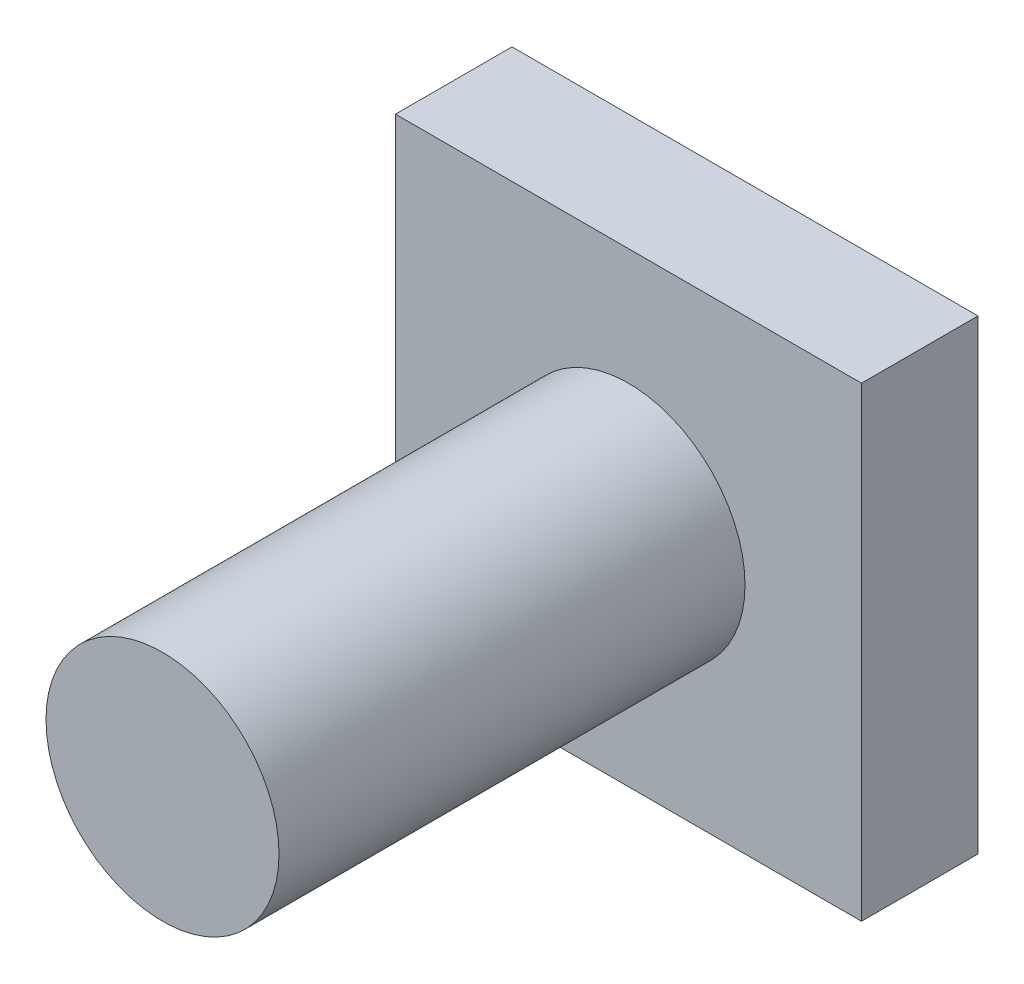
ISO-10303-21;
HEADER;
FILE_DESCRIPTION(('STEP AP214'),'2;1');
FILE_NAME('part.step','',(''),(''),'','','');
FILE_SCHEMA(('AUTOMOTIVE_DESIGN { 1 0 10303 214 1 1 1 1 }'));
ENDSEC;
DATA;
#1=APPLICATION_CONTEXT('core data for automotive mechanical design processes');
#2=APPLICATION_PROTOCOL_DEFINITION('international standard','automotive_design',2000,#1);
#3=PRODUCT_CONTEXT('',#1,'mechanical');
#4=PRODUCT('Part','Part','',(#3));
#5=PRODUCT_RELATED_PRODUCT_CATEGORY('part','',(#4));
#6=PRODUCT_DEFINITION_FORMATION('','',#4);
#7=PRODUCT_DEFINITION_CONTEXT('part definition',#1,'design');
#8=PRODUCT_DEFINITION('design','',#6,#7);
#9=PRODUCT_DEFINITION_SHAPE('','',#8);
#10=(LENGTH_UNIT() NAMED_UNIT(*) SI_UNIT(.MILLI.,.METRE.));
#11=(NAMED_UNIT(*) PLANE_ANGLE_UNIT() SI_UNIT($,.RADIAN.));
#12=(NAMED_UNIT(*) SI_UNIT($,.STERADIAN.) SOLID_ANGLE_UNIT());
#13=UNCERTAINTY_MEASURE_WITH_UNIT(LENGTH_MEASURE(1.E-05),#10,'distance_accuracy_value','');
#14=(GEOMETRIC_REPRESENTATION_CONTEXT(3) GLOBAL_UNCERTAINTY_ASSIGNED_CONTEXT((#13)) GLOBAL_UNIT_ASSIGNED_CONTEXT((#10,
#11,#12)) REPRESENTATION_CONTEXT('',''));
#15=CARTESIAN_POINT('',(0.,0.,0.));
#16=DIRECTION('',(0.,0.,1.));
#17=DIRECTION('',(1.,0.,0.));
#18=AXIS2_PLACEMENT_3D('',#15,#16,#17);
#19=CARTESIAN_POINT('',(0.,0.,10.));
#20=DIRECTION('',(0.,0.,-1.));
#21=DIRECTION('',(-1.,0.,0.));
#22=AXIS2_PLACEMENT_3D('',#19,#20,#21);
#23=CYLINDRICAL_SURFACE('',#22,5.);
#24=CARTESIAN_POINT('',(0.,0.,10.));
#25=DIRECTION('',(0.,0.,1.));
#26=DIRECTION('',(1.,0.,0.));
#27=AXIS2_PLACEMENT_3D('',#24,#25,#26);
#28=CIRCLE('',#27,5.);
#29=CARTESIAN_POINT('',(5.,0.,10.));
#30=VERTEX_POINT('',#29);
#31=EDGE_CURVE('E11',#30,#30,#28,.T.);
#32=ORIENTED_EDGE('',*,*,#31,.F.);
#33=EDGE_LOOP('',(#32));
#34=FACE_BOUND('',#33,.T.);
#35=CARTESIAN_POINT('',(0.,0.,-10.));
#36=DIRECTION('',(0.,0.,1.));
#37=DIRECTION('',(1.,0.,0.));
#38=AXIS2_PLACEMENT_3D('',#35,#36,#37);
#39=CIRCLE('',#38,5.);
#40=CARTESIAN_POINT('',(5.,0.,-10.));
#41=VERTEX_POINT('',#40);
#42=EDGE_CURVE('E42',#41,#41,#39,.T.);
#43=ORIENTED_EDGE('',*,*,#42,.T.);
#44=EDGE_LOOP('',(#43));
#45=FACE_BOUND('',#44,.T.);
#46=ADVANCED_FACE('F39',(#34,#45),#23,.T.);
#47=CARTESIAN_POINT('',(0.,0.,10.));
#48=DIRECTION('',(0.,0.,1.));
#49=DIRECTION('',(1.,0.,0.));
#50=AXIS2_PLACEMENT_3D('',#47,#48,#49);
#51=PLANE('',#50);
#52=ORIENTED_EDGE('',*,*,#31,.T.);
#53=EDGE_LOOP('',(#52));
#54=FACE_BOUND('',#53,.T.);
#55=ADVANCED_FACE('F135',(#54),#51,.T.);
#56=CARTESIAN_POINT('',(-10.,-10.,-15.));
#57=DIRECTION('',(1.,0.,0.));
#58=DIRECTION('',(0.,0.,-1.));
#59=AXIS2_PLACEMENT_3D('',#56,#57,#58);
#60=PLANE('',#59);
#61=DIRECTION('',(0.,1.,0.));
#62=VECTOR('',#61,1.);
#63=CARTESIAN_POINT('',(-10.,-10.,-10.));
#64=LINE('',#63,#62);
#65=CARTESIAN_POINT('',(-10.,-10.,-10.));
#66=VERTEX_POINT('',#65);
#67=CARTESIAN_POINT('',(-10.,10.,-10.));
#68=VERTEX_POINT('',#67);
#69=EDGE_CURVE('E106',#66,#68,#64,.T.);
#70=ORIENTED_EDGE('',*,*,#69,.T.);
#71=DIRECTION('',(0.,0.,1.));
#72=VECTOR('',#71,1.);
#73=CARTESIAN_POINT('',(-10.,10.,-15.));
#74=LINE('',#73,#72);
#75=CARTESIAN_POINT('',(-10.,10.,-15.));
#76=VERTEX_POINT('',#75);
#77=EDGE_CURVE('E97',#76,#68,#74,.T.);
#78=ORIENTED_EDGE('',*,*,#77,.F.);
#79=DIRECTION('',(0.,1.,0.));
#80=VECTOR('',#79,1.);
#81=CARTESIAN_POINT('',(-10.,-10.,-15.));
#82=LINE('',#81,#80);
#83=CARTESIAN_POINT('',(-10.,-10.,-15.));
#84=VERTEX_POINT('',#83);
#85=EDGE_CURVE('E91',#84,#76,#82,.T.);
#86=ORIENTED_EDGE('',*,*,#85,.F.);
#87=DIRECTION('',(0.,0.,1.));
#88=VECTOR('',#87,1.);
#89=CARTESIAN_POINT('',(-10.,-10.,-15.));
#90=LINE('',#89,#88);
#91=EDGE_CURVE('E102',#84,#66,#90,.T.);
#92=ORIENTED_EDGE('',*,*,#91,.T.);
#93=EDGE_LOOP('',(#70,#78,#86,#92));
#94=FACE_BOUND('',#93,.T.);
#95=ADVANCED_FACE('F124',(#94),#60,.F.);
#96=CARTESIAN_POINT('',(10.,10.,-15.));
#97=DIRECTION('',(0.,-1.,0.));
#98=DIRECTION('',(0.,0.,-1.));
#99=AXIS2_PLACEMENT_3D('',#96,#97,#98);
#100=PLANE('',#99);
#101=DIRECTION('',(1.,0.,0.));
#102=VECTOR('',#101,1.);
#103=CARTESIAN_POINT('',(10.,10.,-10.));
#104=LINE('',#103,#102);
#105=CARTESIAN_POINT('',(10.,10.,-10.));
#106=VERTEX_POINT('',#105);
#107=EDGE_CURVE('E96',#68,#106,#104,.T.);
#108=ORIENTED_EDGE('',*,*,#107,.T.);
#109=DIRECTION('',(0.,0.,1.));
#110=VECTOR('',#109,1.);
#111=CARTESIAN_POINT('',(10.,10.,-15.));
#112=LINE('',#111,#110);
#113=CARTESIAN_POINT('',(10.,10.,-15.));
#114=VERTEX_POINT('',#113);
#115=EDGE_CURVE('E94',#114,#106,#112,.T.);
#116=ORIENTED_EDGE('',*,*,#115,.F.);
#117=DIRECTION('',(1.,0.,0.));
#118=VECTOR('',#117,1.);
#119=CARTESIAN_POINT('',(10.,10.,-15.));
#120=LINE('',#119,#118);
#121=EDGE_CURVE('E86',#76,#114,#120,.T.);
#122=ORIENTED_EDGE('',*,*,#121,.F.);
#123=ORIENTED_EDGE('',*,*,#77,.T.);
#124=EDGE_LOOP('',(#108,#116,#122,#123));
#125=FACE_BOUND('',#124,.T.);
#126=ADVANCED_FACE('F95',(#125),#100,.F.);
#127=CARTESIAN_POINT('',(10.,-10.,-15.));
#128=DIRECTION('',(-1.,0.,0.));
#129=DIRECTION('',(0.,0.,1.));
#130=AXIS2_PLACEMENT_3D('',#127,#128,#129);
#131=PLANE('',#130);
#132=DIRECTION('',(0.,-1.,0.));
#133=VECTOR('',#132,1.);
#134=CARTESIAN_POINT('',(10.,-10.,-10.));
#135=LINE('',#134,#133);
#136=CARTESIAN_POINT('',(10.,-10.,-10.));
#137=VERTEX_POINT('',#136);
#138=EDGE_CURVE('E72',#106,#137,#135,.T.);
#139=ORIENTED_EDGE('',*,*,#138,.T.);
#140=DIRECTION('',(0.,0.,1.));
#141=VECTOR('',#140,1.);
#142=CARTESIAN_POINT('',(10.,-10.,-15.));
#143=LINE('',#142,#141);
#144=CARTESIAN_POINT('',(10.,-10.,-15.));
#145=VERTEX_POINT('',#144);
#146=EDGE_CURVE('E98',#145,#137,#143,.T.);
#147=ORIENTED_EDGE('',*,*,#146,.F.);
#148=DIRECTION('',(0.,-1.,0.));
#149=VECTOR('',#148,1.);
#150=CARTESIAN_POINT('',(10.,-10.,-15.));
#151=LINE('',#150,#149);
#152=EDGE_CURVE('E89',#114,#145,#151,.T.);
#153=ORIENTED_EDGE('',*,*,#152,.F.);
#154=ORIENTED_EDGE('',*,*,#115,.T.);
#155=EDGE_LOOP('',(#139,#147,#153,#154));
#156=FACE_BOUND('',#155,.T.);
#157=ADVANCED_FACE('F100',(#156),#131,.F.);
#158=CARTESIAN_POINT('',(10.,-10.,-15.));
#159=DIRECTION('',(0.,1.,0.));
#160=DIRECTION('',(0.,0.,1.));
#161=AXIS2_PLACEMENT_3D('',#158,#159,#160);
#162=PLANE('',#161);
#163=DIRECTION('',(-1.,0.,0.));
#164=VECTOR('',#163,1.);
#165=CARTESIAN_POINT('',(10.,-10.,-10.));
#166=LINE('',#165,#164);
#167=EDGE_CURVE('E78',#137,#66,#166,.T.);
#168=ORIENTED_EDGE('',*,*,#167,.T.);
#169=ORIENTED_EDGE('',*,*,#91,.F.);
#170=DIRECTION('',(-1.,0.,0.));
#171=VECTOR('',#170,1.);
#172=CARTESIAN_POINT('',(10.,-10.,-15.));
#173=LINE('',#172,#171);
#174=EDGE_CURVE('E55',#145,#84,#173,.T.);
#175=ORIENTED_EDGE('',*,*,#174,.F.);
#176=ORIENTED_EDGE('',*,*,#146,.T.);
#177=EDGE_LOOP('',(#168,#169,#175,#176));
#178=FACE_BOUND('',#177,.T.);
#179=ADVANCED_FACE('F125',(#178),#162,.F.);
#180=CARTESIAN_POINT('',(0.,0.,-15.));
#181=DIRECTION('',(0.,0.,1.));
#182=DIRECTION('',(1.,0.,0.));
#183=AXIS2_PLACEMENT_3D('',#180,#181,#182);
#184=PLANE('',#183);
#185=ORIENTED_EDGE('',*,*,#85,.T.);
#186=ORIENTED_EDGE('',*,*,#121,.T.);
#187=ORIENTED_EDGE('',*,*,#152,.T.);
#188=ORIENTED_EDGE('',*,*,#174,.T.);
#189=EDGE_LOOP('',(#185,#186,#187,#188));
#190=FACE_BOUND('',#189,.T.);
#191=ADVANCED_FACE('F87',(#190),#184,.F.);
#192=CARTESIAN_POINT('',(0.,0.,-10.));
#193=DIRECTION('',(0.,0.,1.));
#194=DIRECTION('',(1.,0.,0.));
#195=AXIS2_PLACEMENT_3D('',#192,#193,#194);
#196=PLANE('',#195);
#197=ORIENTED_EDGE('',*,*,#42,.F.);
#198=EDGE_LOOP('',(#197));
#199=FACE_BOUND('',#198,.T.);
#200=ORIENTED_EDGE('',*,*,#69,.F.);
#201=ORIENTED_EDGE('',*,*,#167,.F.);
#202=ORIENTED_EDGE('',*,*,#138,.F.);
#203=ORIENTED_EDGE('',*,*,#107,.F.);
#204=EDGE_LOOP('',(#200,#201,#202,#203));
#205=FACE_BOUND('',#204,.T.);
#206=ADVANCED_FACE('F118',(#199,#205),#196,.T.);
#207=CLOSED_SHELL('',(#46,#55,#95,#126,#157,#179,#191,#206));
#208=MANIFOLD_SOLID_BREP('B2',#207);
#209=ADVANCED_BREP_SHAPE_REPRESENTATION('',(#18,#208),#14);
#210=SHAPE_DEFINITION_REPRESENTATION(#9,#209);
ENDSEC;
END-ISO-10303-21;
